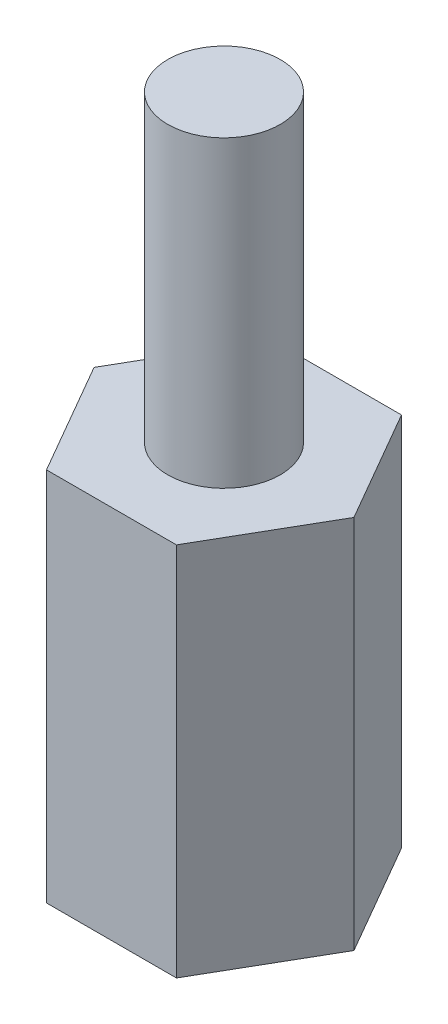
ISO-10303-21;
HEADER;
FILE_DESCRIPTION(('STEP AP214'),'2;1');
FILE_NAME('part.step','',(''),(''),'','','');
FILE_SCHEMA(('AUTOMOTIVE_DESIGN { 1 0 10303 214 1 1 1 1 }'));
ENDSEC;
DATA;
#1=APPLICATION_CONTEXT('core data for automotive mechanical design processes');
#2=APPLICATION_PROTOCOL_DEFINITION('international standard','automotive_design',2000,#1);
#3=PRODUCT_CONTEXT('',#1,'mechanical');
#4=PRODUCT('Part','Part','',(#3));
#5=PRODUCT_RELATED_PRODUCT_CATEGORY('part','',(#4));
#6=PRODUCT_DEFINITION_FORMATION('','',#4);
#7=PRODUCT_DEFINITION_CONTEXT('part definition',#1,'design');
#8=PRODUCT_DEFINITION('design','',#6,#7);
#9=PRODUCT_DEFINITION_SHAPE('','',#8);
#10=(LENGTH_UNIT() NAMED_UNIT(*) SI_UNIT(.MILLI.,.METRE.));
#11=(NAMED_UNIT(*) PLANE_ANGLE_UNIT() SI_UNIT($,.RADIAN.));
#12=(NAMED_UNIT(*) SI_UNIT($,.STERADIAN.) SOLID_ANGLE_UNIT());
#13=UNCERTAINTY_MEASURE_WITH_UNIT(LENGTH_MEASURE(1.E-05),#10,'distance_accuracy_value','');
#14=(GEOMETRIC_REPRESENTATION_CONTEXT(3) GLOBAL_UNCERTAINTY_ASSIGNED_CONTEXT((#13)) GLOBAL_UNIT_ASSIGNED_CONTEXT((#10,
#11,#12)) REPRESENTATION_CONTEXT('',''));
#15=CARTESIAN_POINT('',(0.,0.,0.));
#16=DIRECTION('',(0.,0.,1.));
#17=DIRECTION('',(1.,0.,0.));
#18=AXIS2_PLACEMENT_3D('',#15,#16,#17);
#19=CARTESIAN_POINT('',(-1.73205080756888,10.,-3.));
#20=DIRECTION('',(0.866025403784439,0.,0.5));
#21=DIRECTION('',(0.5,0.,-0.866025403784439));
#22=AXIS2_PLACEMENT_3D('',#19,#20,#21);
#23=PLANE('',#22);
#24=DIRECTION('',(-0.5,0.,0.866025403784439));
#25=VECTOR('',#24,1.);
#26=CARTESIAN_POINT('',(-1.73205080756888,0.,-3.));
#27=LINE('',#26,#25);
#28=CARTESIAN_POINT('',(-1.73205080756888,0.,-3.));
#29=VERTEX_POINT('',#28);
#30=CARTESIAN_POINT('',(-3.46410161513775,0.,0.));
#31=VERTEX_POINT('',#30);
#32=EDGE_CURVE('E123',#29,#31,#27,.T.);
#33=ORIENTED_EDGE('',*,*,#32,.T.);
#34=DIRECTION('',(0.,-1.,0.));
#35=VECTOR('',#34,1.);
#36=CARTESIAN_POINT('',(-3.46410161513775,10.,0.));
#37=LINE('',#36,#35);
#38=CARTESIAN_POINT('',(-3.46410161513775,10.,0.));
#39=VERTEX_POINT('',#38);
#40=EDGE_CURVE('E40',#39,#31,#37,.T.);
#41=ORIENTED_EDGE('',*,*,#40,.F.);
#42=DIRECTION('',(-0.5,0.,0.866025403784439));
#43=VECTOR('',#42,1.);
#44=CARTESIAN_POINT('',(-1.73205080756888,10.,-3.));
#45=LINE('',#44,#43);
#46=CARTESIAN_POINT('',(-1.73205080756888,10.,-3.));
#47=VERTEX_POINT('',#46);
#48=EDGE_CURVE('E134',#47,#39,#45,.T.);
#49=ORIENTED_EDGE('',*,*,#48,.F.);
#50=DIRECTION('',(0.,-1.,0.));
#51=VECTOR('',#50,1.);
#52=CARTESIAN_POINT('',(-1.73205080756888,10.,-3.));
#53=LINE('',#52,#51);
#54=EDGE_CURVE('E119',#47,#29,#53,.T.);
#55=ORIENTED_EDGE('',*,*,#54,.T.);
#56=EDGE_LOOP('',(#33,#41,#49,#55));
#57=FACE_BOUND('',#56,.T.);
#58=ADVANCED_FACE('F37',(#57),#23,.F.);
#59=CARTESIAN_POINT('',(-3.46410161513775,10.,0.));
#60=DIRECTION('',(0.866025403784439,0.,-0.5));
#61=DIRECTION('',(-0.5,0.,-0.866025403784439));
#62=AXIS2_PLACEMENT_3D('',#59,#60,#61);
#63=PLANE('',#62);
#64=DIRECTION('',(0.5,0.,0.866025403784439));
#65=VECTOR('',#64,1.);
#66=CARTESIAN_POINT('',(-3.46410161513775,0.,0.));
#67=LINE('',#66,#65);
#68=CARTESIAN_POINT('',(-1.73205080756888,0.,3.));
#69=VERTEX_POINT('',#68);
#70=EDGE_CURVE('E126',#31,#69,#67,.T.);
#71=ORIENTED_EDGE('',*,*,#70,.T.);
#72=DIRECTION('',(0.,-1.,0.));
#73=VECTOR('',#72,1.);
#74=CARTESIAN_POINT('',(-1.73205080756888,10.,3.));
#75=LINE('',#74,#73);
#76=CARTESIAN_POINT('',(-1.73205080756888,10.,3.));
#77=VERTEX_POINT('',#76);
#78=EDGE_CURVE('E137',#77,#69,#75,.T.);
#79=ORIENTED_EDGE('',*,*,#78,.F.);
#80=DIRECTION('',(0.5,0.,0.866025403784439));
#81=VECTOR('',#80,1.);
#82=CARTESIAN_POINT('',(-3.46410161513775,10.,0.));
#83=LINE('',#82,#81);
#84=EDGE_CURVE('E92',#39,#77,#83,.T.);
#85=ORIENTED_EDGE('',*,*,#84,.F.);
#86=ORIENTED_EDGE('',*,*,#40,.T.);
#87=EDGE_LOOP('',(#71,#79,#85,#86));
#88=FACE_BOUND('',#87,.T.);
#89=ADVANCED_FACE('F142',(#88),#63,.F.);
#90=CARTESIAN_POINT('',(-1.73205080756888,10.,3.));
#91=DIRECTION('',(0.,0.,-1.));
#92=DIRECTION('',(-1.,0.,0.));
#93=AXIS2_PLACEMENT_3D('',#90,#91,#92);
#94=PLANE('',#93);
#95=DIRECTION('',(1.,0.,0.));
#96=VECTOR('',#95,1.);
#97=CARTESIAN_POINT('',(-1.73205080756888,0.,3.));
#98=LINE('',#97,#96);
#99=CARTESIAN_POINT('',(1.73205080756888,0.,3.));
#100=VERTEX_POINT('',#99);
#101=EDGE_CURVE('E129',#69,#100,#98,.T.);
#102=ORIENTED_EDGE('',*,*,#101,.T.);
#103=DIRECTION('',(0.,-1.,0.));
#104=VECTOR('',#103,1.);
#105=CARTESIAN_POINT('',(1.73205080756888,10.,3.));
#106=LINE('',#105,#104);
#107=CARTESIAN_POINT('',(1.73205080756888,10.,3.));
#108=VERTEX_POINT('',#107);
#109=EDGE_CURVE('E114',#108,#100,#106,.T.);
#110=ORIENTED_EDGE('',*,*,#109,.F.);
#111=DIRECTION('',(1.,0.,0.));
#112=VECTOR('',#111,1.);
#113=CARTESIAN_POINT('',(-1.73205080756888,10.,3.));
#114=LINE('',#113,#112);
#115=EDGE_CURVE('E105',#77,#108,#114,.T.);
#116=ORIENTED_EDGE('',*,*,#115,.F.);
#117=ORIENTED_EDGE('',*,*,#78,.T.);
#118=EDGE_LOOP('',(#102,#110,#116,#117));
#119=FACE_BOUND('',#118,.T.);
#120=ADVANCED_FACE('F148',(#119),#94,.F.);
#121=CARTESIAN_POINT('',(1.73205080756888,10.,3.));
#122=DIRECTION('',(-0.866025403784439,0.,-0.5));
#123=DIRECTION('',(-0.5,0.,0.866025403784439));
#124=AXIS2_PLACEMENT_3D('',#121,#122,#123);
#125=PLANE('',#124);
#126=DIRECTION('',(0.5,0.,-0.866025403784439));
#127=VECTOR('',#126,1.);
#128=CARTESIAN_POINT('',(1.73205080756888,0.,3.));
#129=LINE('',#128,#127);
#130=CARTESIAN_POINT('',(3.46410161513775,0.,0.));
#131=VERTEX_POINT('',#130);
#132=EDGE_CURVE('E113',#100,#131,#129,.T.);
#133=ORIENTED_EDGE('',*,*,#132,.T.);
#134=DIRECTION('',(0.,-1.,0.));
#135=VECTOR('',#134,1.);
#136=CARTESIAN_POINT('',(3.46410161513775,10.,0.));
#137=LINE('',#136,#135);
#138=CARTESIAN_POINT('',(3.46410161513775,10.,0.));
#139=VERTEX_POINT('',#138);
#140=EDGE_CURVE('E110',#139,#131,#137,.T.);
#141=ORIENTED_EDGE('',*,*,#140,.F.);
#142=DIRECTION('',(0.5,0.,-0.866025403784439));
#143=VECTOR('',#142,1.);
#144=CARTESIAN_POINT('',(1.73205080756888,10.,3.));
#145=LINE('',#144,#143);
#146=EDGE_CURVE('E99',#108,#139,#145,.T.);
#147=ORIENTED_EDGE('',*,*,#146,.F.);
#148=ORIENTED_EDGE('',*,*,#109,.T.);
#149=EDGE_LOOP('',(#133,#141,#147,#148));
#150=FACE_BOUND('',#149,.T.);
#151=ADVANCED_FACE('F111',(#150),#125,.F.);
#152=CARTESIAN_POINT('',(3.46410161513775,10.,0.));
#153=DIRECTION('',(-0.866025403784439,0.,0.5));
#154=DIRECTION('',(0.5,0.,0.866025403784439));
#155=AXIS2_PLACEMENT_3D('',#152,#153,#154);
#156=PLANE('',#155);
#157=DIRECTION('',(-0.5,0.,-0.866025403784439));
#158=VECTOR('',#157,1.);
#159=CARTESIAN_POINT('',(3.46410161513775,0.,0.));
#160=LINE('',#159,#158);
#161=CARTESIAN_POINT('',(1.73205080756888,0.,-3.));
#162=VERTEX_POINT('',#161);
#163=EDGE_CURVE('E77',#131,#162,#160,.T.);
#164=ORIENTED_EDGE('',*,*,#163,.T.);
#165=DIRECTION('',(0.,-1.,0.));
#166=VECTOR('',#165,1.);
#167=CARTESIAN_POINT('',(1.73205080756888,10.,-3.));
#168=LINE('',#167,#166);
#169=CARTESIAN_POINT('',(1.73205080756888,10.,-3.));
#170=VERTEX_POINT('',#169);
#171=EDGE_CURVE('E115',#170,#162,#168,.T.);
#172=ORIENTED_EDGE('',*,*,#171,.F.);
#173=DIRECTION('',(-0.5,0.,-0.866025403784439));
#174=VECTOR('',#173,1.);
#175=CARTESIAN_POINT('',(3.46410161513775,10.,0.));
#176=LINE('',#175,#174);
#177=EDGE_CURVE('E103',#139,#170,#176,.T.);
#178=ORIENTED_EDGE('',*,*,#177,.F.);
#179=ORIENTED_EDGE('',*,*,#140,.T.);
#180=EDGE_LOOP('',(#164,#172,#178,#179));
#181=FACE_BOUND('',#180,.T.);
#182=ADVANCED_FACE('F117',(#181),#156,.F.);
#183=CARTESIAN_POINT('',(1.73205080756888,10.,-3.));
#184=DIRECTION('',(0.,0.,1.));
#185=DIRECTION('',(1.,0.,0.));
#186=AXIS2_PLACEMENT_3D('',#183,#184,#185);
#187=PLANE('',#186);
#188=DIRECTION('',(-1.,0.,0.));
#189=VECTOR('',#188,1.);
#190=CARTESIAN_POINT('',(1.73205080756888,0.,-3.));
#191=LINE('',#190,#189);
#192=EDGE_CURVE('E83',#162,#29,#191,.T.);
#193=ORIENTED_EDGE('',*,*,#192,.T.);
#194=ORIENTED_EDGE('',*,*,#54,.F.);
#195=DIRECTION('',(-1.,0.,0.));
#196=VECTOR('',#195,1.);
#197=CARTESIAN_POINT('',(1.73205080756888,10.,-3.));
#198=LINE('',#197,#196);
#199=EDGE_CURVE('E54',#170,#47,#198,.T.);
#200=ORIENTED_EDGE('',*,*,#199,.F.);
#201=ORIENTED_EDGE('',*,*,#171,.T.);
#202=EDGE_LOOP('',(#193,#194,#200,#201));
#203=FACE_BOUND('',#202,.T.);
#204=ADVANCED_FACE('F179',(#203),#187,.F.);
#205=CARTESIAN_POINT('',(0.,10.,0.));
#206=DIRECTION('',(0.,1.,0.));
#207=DIRECTION('',(0.,0.,1.));
#208=AXIS2_PLACEMENT_3D('',#205,#206,#207);
#209=PLANE('',#208);
#210=CARTESIAN_POINT('',(0.,10.,0.));
#211=DIRECTION('',(0.,1.,0.));
#212=DIRECTION('',(0.,0.,1.));
#213=AXIS2_PLACEMENT_3D('',#210,#211,#212);
#214=CIRCLE('',#213,1.5);
#215=CARTESIAN_POINT('',(0.,10.,1.5));
#216=VERTEX_POINT('',#215);
#217=EDGE_CURVE('E11',#216,#216,#214,.T.);
#218=ORIENTED_EDGE('',*,*,#217,.F.);
#219=EDGE_LOOP('',(#218));
#220=FACE_BOUND('',#219,.T.);
#221=ORIENTED_EDGE('',*,*,#48,.T.);
#222=ORIENTED_EDGE('',*,*,#84,.T.);
#223=ORIENTED_EDGE('',*,*,#115,.T.);
#224=ORIENTED_EDGE('',*,*,#146,.T.);
#225=ORIENTED_EDGE('',*,*,#177,.T.);
#226=ORIENTED_EDGE('',*,*,#199,.T.);
#227=EDGE_LOOP('',(#221,#222,#223,#224,#225,#226));
#228=FACE_BOUND('',#227,.T.);
#229=ADVANCED_FACE('F101',(#220,#228),#209,.T.);
#230=CARTESIAN_POINT('',(0.,0.,0.));
#231=DIRECTION('',(0.,1.,0.));
#232=DIRECTION('',(0.,0.,1.));
#233=AXIS2_PLACEMENT_3D('',#230,#231,#232);
#234=PLANE('',#233);
#235=CARTESIAN_POINT('',(0.,0.,0.));
#236=DIRECTION('',(0.,-1.,0.));
#237=DIRECTION('',(0.,0.,-1.));
#238=AXIS2_PLACEMENT_3D('',#235,#236,#237);
#239=CIRCLE('',#238,1.5);
#240=CARTESIAN_POINT('',(0.,0.,-1.5));
#241=VERTEX_POINT('',#240);
#242=EDGE_CURVE('E155',#241,#241,#239,.T.);
#243=ORIENTED_EDGE('',*,*,#242,.F.);
#244=EDGE_LOOP('',(#243));
#245=FACE_BOUND('',#244,.T.);
#246=ORIENTED_EDGE('',*,*,#32,.F.);
#247=ORIENTED_EDGE('',*,*,#192,.F.);
#248=ORIENTED_EDGE('',*,*,#163,.F.);
#249=ORIENTED_EDGE('',*,*,#132,.F.);
#250=ORIENTED_EDGE('',*,*,#101,.F.);
#251=ORIENTED_EDGE('',*,*,#70,.F.);
#252=EDGE_LOOP('',(#246,#247,#248,#249,#250,#251));
#253=FACE_BOUND('',#252,.T.);
#254=ADVANCED_FACE('F147',(#245,#253),#234,.F.);
#255=CARTESIAN_POINT('',(0.,18.0916054709663,0.));
#256=DIRECTION('',(0.,-1.,0.));
#257=DIRECTION('',(0.,0.,-1.));
#258=AXIS2_PLACEMENT_3D('',#255,#256,#257);
#259=CYLINDRICAL_SURFACE('',#258,1.5);
#260=CARTESIAN_POINT('',(0.,18.0916054709663,0.));
#261=DIRECTION('',(0.,1.,0.));
#262=DIRECTION('',(0.,0.,1.));
#263=AXIS2_PLACEMENT_3D('',#260,#261,#262);
#264=CIRCLE('',#263,1.5);
#265=CARTESIAN_POINT('',(0.,18.0916054709663,1.5));
#266=VERTEX_POINT('',#265);
#267=EDGE_CURVE('E127',#266,#266,#264,.T.);
#268=ORIENTED_EDGE('',*,*,#267,.F.);
#269=EDGE_LOOP('',(#268));
#270=FACE_BOUND('',#269,.T.);
#271=ORIENTED_EDGE('',*,*,#217,.T.);
#272=EDGE_LOOP('',(#271));
#273=FACE_BOUND('',#272,.T.);
#274=ADVANCED_FACE('F171',(#270,#273),#259,.T.);
#275=CARTESIAN_POINT('',(0.,18.0916054709663,0.));
#276=DIRECTION('',(0.,1.,0.));
#277=DIRECTION('',(0.,0.,1.));
#278=AXIS2_PLACEMENT_3D('',#275,#276,#277);
#279=PLANE('',#278);
#280=ORIENTED_EDGE('',*,*,#267,.T.);
#281=EDGE_LOOP('',(#280));
#282=FACE_BOUND('',#281,.T.);
#283=ADVANCED_FACE('F166',(#282),#279,.T.);
#284=CARTESIAN_POINT('',(0.,4.,0.));
#285=DIRECTION('',(0.,-1.,0.));
#286=DIRECTION('',(0.,0.,-1.));
#287=AXIS2_PLACEMENT_3D('',#284,#285,#286);
#288=CYLINDRICAL_SURFACE('',#287,1.5);
#289=CARTESIAN_POINT('',(0.,4.,0.));
#290=DIRECTION('',(0.,-1.,0.));
#291=DIRECTION('',(0.,0.,-1.));
#292=AXIS2_PLACEMENT_3D('',#289,#290,#291);
#293=CIRCLE('',#292,1.5);
#294=CARTESIAN_POINT('',(0.,4.,-1.5));
#295=VERTEX_POINT('',#294);
#296=EDGE_CURVE('E154',#295,#295,#293,.T.);
#297=ORIENTED_EDGE('',*,*,#296,.F.);
#298=EDGE_LOOP('',(#297));
#299=FACE_BOUND('',#298,.T.);
#300=ORIENTED_EDGE('',*,*,#242,.T.);
#301=EDGE_LOOP('',(#300));
#302=FACE_BOUND('',#301,.T.);
#303=ADVANCED_FACE('F163',(#299,#302),#288,.F.);
#304=CARTESIAN_POINT('',(0.,4.,0.));
#305=DIRECTION('',(0.,-1.,0.));
#306=DIRECTION('',(0.,0.,-1.));
#307=AXIS2_PLACEMENT_3D('',#304,#305,#306);
#308=PLANE('',#307);
#309=ORIENTED_EDGE('',*,*,#296,.T.);
#310=EDGE_LOOP('',(#309));
#311=FACE_BOUND('',#310,.T.);
#312=ADVANCED_FACE('F161',(#311),#308,.T.);
#313=CLOSED_SHELL('',(#58,#89,#120,#151,#182,#204,#229,#254,#274,#283,#303,#312));
#314=MANIFOLD_SOLID_BREP('B2',#313);
#315=ADVANCED_BREP_SHAPE_REPRESENTATION('',(#18,#314),#14);
#316=SHAPE_DEFINITION_REPRESENTATION(#9,#315);
ENDSEC;
END-ISO-10303-21;
